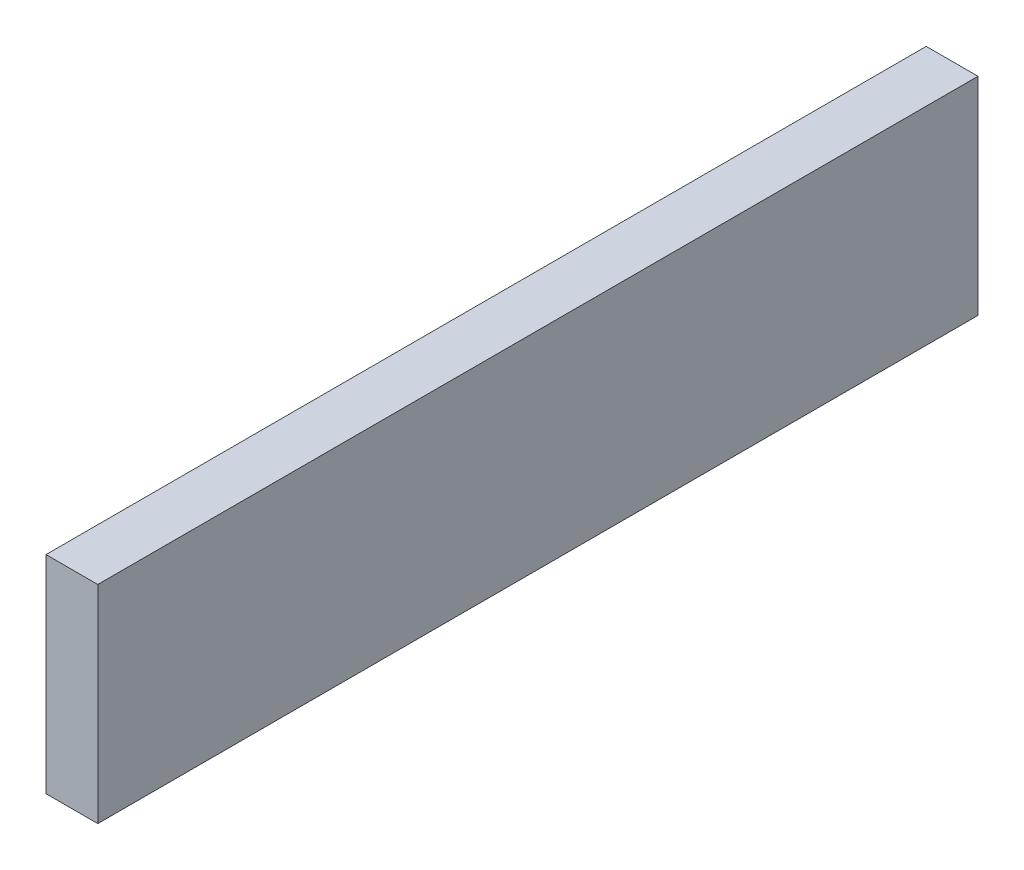
ISO-10303-21;
HEADER;
FILE_DESCRIPTION(('STEP AP214'),'2;1');
FILE_NAME('part.step','',(''),(''),'','','');
FILE_SCHEMA(('AUTOMOTIVE_DESIGN { 1 0 10303 214 1 1 1 1 }'));
ENDSEC;
DATA;
#1=APPLICATION_CONTEXT('core data for automotive mechanical design processes');
#2=APPLICATION_PROTOCOL_DEFINITION('international standard','automotive_design',2000,#1);
#3=PRODUCT_CONTEXT('',#1,'mechanical');
#4=PRODUCT('Part','Part','',(#3));
#5=PRODUCT_RELATED_PRODUCT_CATEGORY('part','',(#4));
#6=PRODUCT_DEFINITION_FORMATION('','',#4);
#7=PRODUCT_DEFINITION_CONTEXT('part definition',#1,'design');
#8=PRODUCT_DEFINITION('design','',#6,#7);
#9=PRODUCT_DEFINITION_SHAPE('','',#8);
#10=(LENGTH_UNIT() NAMED_UNIT(*) SI_UNIT(.MILLI.,.METRE.));
#11=(NAMED_UNIT(*) PLANE_ANGLE_UNIT() SI_UNIT($,.RADIAN.));
#12=(NAMED_UNIT(*) SI_UNIT($,.STERADIAN.) SOLID_ANGLE_UNIT());
#13=UNCERTAINTY_MEASURE_WITH_UNIT(LENGTH_MEASURE(1.E-05),#10,'distance_accuracy_value','');
#14=(GEOMETRIC_REPRESENTATION_CONTEXT(3) GLOBAL_UNCERTAINTY_ASSIGNED_CONTEXT((#13)) GLOBAL_UNIT_ASSIGNED_CONTEXT((#10,
#11,#12)) REPRESENTATION_CONTEXT('',''));
#15=CARTESIAN_POINT('',(0.,0.,0.));
#16=DIRECTION('',(0.,0.,1.));
#17=DIRECTION('',(1.,0.,0.));
#18=AXIS2_PLACEMENT_3D('',#15,#16,#17);
#19=CARTESIAN_POINT('',(-5.,15.,-80.));
#20=DIRECTION('',(1.,0.,0.));
#21=DIRECTION('',(0.,0.,-1.));
#22=AXIS2_PLACEMENT_3D('',#19,#20,#21);
#23=CYLINDRICAL_SURFACE('',#22,2.5);
#24=CARTESIAN_POINT('',(-5.,15.,-80.));
#25=DIRECTION('',(1.,0.,0.));
#26=DIRECTION('',(0.,0.,-1.));
#27=AXIS2_PLACEMENT_3D('',#24,#25,#26);
#28=CIRCLE('',#27,2.5);
#29=CARTESIAN_POINT('',(-5.,15.,-82.5));
#30=VERTEX_POINT('',#29);
#31=EDGE_CURVE('E153',#30,#30,#28,.T.);
#32=ORIENTED_EDGE('',*,*,#31,.F.);
#33=EDGE_LOOP('',(#32));
#34=FACE_BOUND('',#33,.T.);
#35=DIRECTION('',(1.,0.,0.));
#36=VECTOR('',#35,1.);
#37=CARTESIAN_POINT('',(-5.,17.5,-80.));
#38=LINE('',#37,#36);
#39=CARTESIAN_POINT('',(0.,17.5,-80.));
#40=VERTEX_POINT('',#39);
#41=CARTESIAN_POINT('',(-1.14163469475345,17.5,-80.));
#42=VERTEX_POINT('',#41);
#43=EDGE_CURVE('E126',#40,#42,#38,.F.);
#44=ORIENTED_EDGE('',*,*,#43,.F.);
#45=CARTESIAN_POINT('',(0.,15.,-80.));
#46=DIRECTION('',(1.,0.,0.));
#47=DIRECTION('',(0.,0.,-1.));
#48=AXIS2_PLACEMENT_3D('',#45,#46,#47);
#49=CIRCLE('',#48,2.5);
#50=CARTESIAN_POINT('',(0.,12.5,-80.));
#51=VERTEX_POINT('',#50);
#52=EDGE_CURVE('E150',#40,#51,#49,.T.);
#53=ORIENTED_EDGE('',*,*,#52,.T.);
#54=DIRECTION('',(1.,0.,0.));
#55=VECTOR('',#54,1.);
#56=CARTESIAN_POINT('',(-5.,12.5,-80.));
#57=LINE('',#56,#55);
#58=CARTESIAN_POINT('',(-1.14163469475345,12.5,-80.));
#59=VERTEX_POINT('',#58);
#60=EDGE_CURVE('E61',#59,#51,#57,.T.);
#61=ORIENTED_EDGE('',*,*,#60,.F.);
#62=CARTESIAN_POINT('',(-1.14163469475345,12.5,-80.));
#63=CARTESIAN_POINT('',(-1.14160076156349,12.4999926023262,-80.0368502720209));
#64=CARTESIAN_POINT('',(-1.14341979627242,12.5008149573185,-80.073661902073));
#65=CARTESIAN_POINT('',(-1.15046671672525,12.5040470353658,-80.1467838954639));
#66=CARTESIAN_POINT('',(-1.15568474507948,12.5064521684275,-80.1830953992171));
#67=CARTESIAN_POINT('',(-1.17574984538147,12.5158195285853,-80.2895797920049));
#68=CARTESIAN_POINT('',(-1.19503129720871,12.5249399036378,-80.3587436435111));
#69=CARTESIAN_POINT('',(-1.23621034960396,12.5453108304804,-80.4766233272089));
#70=CARTESIAN_POINT('',(-1.25631658794231,12.5554958479592,-80.526205106889));
#71=CARTESIAN_POINT('',(-1.29995963203381,12.5784204069825,-80.6232421432369));
#72=CARTESIAN_POINT('',(-1.32349834580788,12.5911613707986,-80.6706961978512));
#73=CARTESIAN_POINT('',(-1.39814883907714,12.6331964226857,-80.8111031831776));
#74=CARTESIAN_POINT('',(-1.45287485858452,12.6661094830148,-80.9010420636721));
#75=CARTESIAN_POINT('',(-1.55959421692941,12.73623861884,-81.0640857860633));
#76=CARTESIAN_POINT('',(-1.61114375530578,12.772483622706,-81.1379228903791));
#77=CARTESIAN_POINT('',(-1.71533215524021,12.851687642325,-81.2811932461923));
#78=CARTESIAN_POINT('',(-1.76797171065065,12.8946510562687,-81.3506235706434));
#79=CARTESIAN_POINT('',(-1.87260869934322,12.9871583938909,-81.4849551546248));
#80=CARTESIAN_POINT('',(-1.92460775881692,13.0366781555405,-81.5498717694767));
#81=CARTESIAN_POINT('',(-2.0269674090949,13.1425401441895,-81.6752836067289));
#82=CARTESIAN_POINT('',(-2.07732793533397,13.1988826396218,-81.7357786550173));
#83=CARTESIAN_POINT('',(-2.2000763224716,13.3487770259388,-81.8812813344049));
#84=CARTESIAN_POINT('',(-2.27076062917807,13.446761725856,-81.9632601622299));
#85=CARTESIAN_POINT('',(-2.40199184485351,13.6586392494052,-82.1136622825676));
#86=CARTESIAN_POINT('',(-2.46255230632799,13.7725104252558,-82.1821037200708));
#87=CARTESIAN_POINT('',(-2.55860750368915,13.9909809715952,-82.2898933697334));
#88=CARTESIAN_POINT('',(-2.59669230645544,14.0929067887458,-82.3323212540958));
#89=CARTESIAN_POINT('',(-2.66125365331357,14.3048062749799,-82.4039934113646));
#90=CARTESIAN_POINT('',(-2.68773787875698,14.4147745622478,-82.4332464084191));
#91=CARTESIAN_POINT('',(-2.72718514012938,14.6408059676342,-82.4767507613322));
#92=CARTESIAN_POINT('',(-2.74006173855933,14.756903187467,-82.490906220768));
#93=CARTESIAN_POINT('',(-2.75080104032359,14.99061896676,-82.502715205675));
#94=CARTESIAN_POINT('',(-2.74866932696633,15.1082369442241,-82.5003748678203));
#95=CARTESIAN_POINT('',(-2.73060300572644,15.3288318203435,-82.4804992345782));
#96=CARTESIAN_POINT('',(-2.71609949802632,15.4320777366107,-82.4645393037708));
#97=CARTESIAN_POINT('',(-2.67623992461479,15.6337527654284,-82.4205405669562));
#98=CARTESIAN_POINT('',(-2.65088179243374,15.7321809568173,-82.3924994609658));
#99=CARTESIAN_POINT('',(-2.58938300070457,15.92702634459,-82.3241791031935));
#100=CARTESIAN_POINT('',(-2.55277136676985,16.023103713234,-82.2833634880565));
#101=CARTESIAN_POINT('',(-2.47132764746236,16.2066380253475,-82.1919299994505));
#102=CARTESIAN_POINT('',(-2.42649216990778,16.294091388603,-82.141308080579));
#103=CARTESIAN_POINT('',(-2.30516294939391,16.5036366056833,-82.0030202663711));
#104=CARTESIAN_POINT('',(-2.22443057699893,16.6197198394661,-81.9098842225934));
#105=CARTESIAN_POINT('',(-2.09691006790649,16.7779010157724,-81.7590942714993));
#106=CARTESIAN_POINT('',(-2.05323441851514,16.8280592167664,-81.7068619184366));
#107=CARTESIAN_POINT('',(-1.96445229685118,16.9231422669238,-81.5989643676562));
#108=CARTESIAN_POINT('',(-1.91934634802306,16.9680690031459,-81.5433004189109));
#109=CARTESIAN_POINT('',(-1.82736009816155,17.0538101995861,-81.4273040581398));
#110=CARTESIAN_POINT('',(-1.7804634100269,17.0944968018115,-81.366890638058));
#111=CARTESIAN_POINT('',(-1.68694069316833,17.1705269851909,-81.2426250454067));
#112=CARTESIAN_POINT('',(-1.64031457717538,17.2058723931044,-81.1787740587101));
#113=CARTESIAN_POINT('',(-1.54863005708555,17.2711747631872,-81.0474444298911));
#114=CARTESIAN_POINT('',(-1.50356952887258,17.3011392761428,-80.9799710465164));
#115=CARTESIAN_POINT('',(-1.41681154793987,17.3555433946536,-80.8408272694385));
#116=CARTESIAN_POINT('',(-1.37511000697689,17.3799897837555,-80.7691621667494));
#117=CARTESIAN_POINT('',(-1.3018831566406,17.4207442124286,-80.6283407249032));
#118=CARTESIAN_POINT('',(-1.26975386377006,17.4376277796402,-80.5596731596984));
#119=CARTESIAN_POINT('',(-1.2140902850961,17.4658237922952,-80.4181628310735));
#120=CARTESIAN_POINT('',(-1.19050023248075,17.477172559261,-80.3453508885953));
#121=CARTESIAN_POINT('',(-1.16314610329853,17.4900917640084,-80.226703361983));
#122=CARTESIAN_POINT('',(-1.1552185718857,17.4937638802054,-80.1820676712598));
#123=CARTESIAN_POINT('',(-1.14439929747673,17.4987381312888,-80.0916553270764));
#124=CARTESIAN_POINT('',(-1.14155441837776,17.5000182156772,-80.0458719631663));
#125=CARTESIAN_POINT('',(-1.14163469475345,17.5,-80.));
#126=B_SPLINE_CURVE_WITH_KNOTS('',3,(#62,#63,#64,#65,#66,#67,#68,#69,#70,#71,#72,#73,#74,#75,
#76,#77,#78,#79,#80,#81,#82,#83,#84,#85,#86,#87,#88,#89,#90,#91,#92,#93,#94,#95,#96,#97,#98,#99,
#100,#101,#102,#103,#104,#105,#106,#107,#108,#109,#110,#111,#112,#113,#114,#115,#116,#117,#118,
#119,#120,#121,#122,#123,#124,#125),.UNSPECIFIED.,.F.,.F.,(4,2,2,2,2,2,2,2,2,2,2,2,2,2,2,2,2,2,
2,2,2,2,2,2,2,2,2,2,2,2,2,4),(0.,0.110430513479198,0.220542185791148,0.43651832786487,
0.599705091455743,0.762982914441691,1.09296850825457,1.38387832708183,1.67497939279735,
1.96503606986894,2.25510416260649,2.69149720546061,3.12730130018987,3.47626888442438,
3.82500504829078,4.17594335561103,4.52675111571979,4.84175119004055,5.15681125978515,
5.48744292957862,5.81821128670639,6.32314942689101,6.57668526888297,6.83012937195455,
7.08978847282512,7.34935856484583,7.60856151709355,7.86744406892527,8.09994061530373,
8.33089018140405,8.46700588163959,8.60437026462268),.UNSPECIFIED.);
#127=EDGE_CURVE('E218',#59,#42,#126,.T.);
#128=ORIENTED_EDGE('',*,*,#127,.T.);
#129=EDGE_LOOP('',(#44,#53,#61,#128));
#130=FACE_BOUND('',#129,.T.);
#131=ADVANCED_FACE('F33',(#34,#130),#23,.F.);
#132=CARTESIAN_POINT('',(0.,15.,-80.));
#133=DIRECTION('',(1.,0.,0.));
#134=DIRECTION('',(0.,0.,-1.));
#135=AXIS2_PLACEMENT_3D('',#132,#133,#134);
#136=PLANE('',#135);
#137=DIRECTION('',(0.,1.,0.));
#138=VECTOR('',#137,1.);
#139=CARTESIAN_POINT('',(0.,15.,-80.));
#140=LINE('',#139,#138);
#141=EDGE_CURVE('E216',#51,#40,#140,.T.);
#142=ORIENTED_EDGE('',*,*,#141,.F.);
#143=ORIENTED_EDGE('',*,*,#52,.F.);
#144=EDGE_LOOP('',(#142,#143));
#145=FACE_BOUND('',#144,.T.);
#146=ADVANCED_FACE('F267',(#145),#136,.F.);
#147=CARTESIAN_POINT('',(5.,-20.,-85.));
#148=DIRECTION('',(0.,0.,1.));
#149=DIRECTION('',(1.,0.,0.));
#150=AXIS2_PLACEMENT_3D('',#147,#148,#149);
#151=PLANE('',#150);
#152=CARTESIAN_POINT('',(-1.57984021985929E-13,0.,-85.));
#153=DIRECTION('',(0.,0.,-1.));
#154=DIRECTION('',(-1.,0.,0.));
#155=AXIS2_PLACEMENT_3D('',#152,#153,#154);
#156=CIRCLE('',#155,2.74833218084437);
#157=CARTESIAN_POINT('',(-2.74833218084453,0.,-85.));
#158=VERTEX_POINT('',#157);
#159=EDGE_CURVE('E306',#158,#158,#156,.T.);
#160=ORIENTED_EDGE('',*,*,#159,.F.);
#161=EDGE_LOOP('',(#160));
#162=FACE_BOUND('',#161,.T.);
#163=CARTESIAN_POINT('',(0.,-15.,-85.));
#164=DIRECTION('',(0.,0.,-1.));
#165=DIRECTION('',(1.,0.,0.));
#166=AXIS2_PLACEMENT_3D('',#163,#164,#165);
#167=CIRCLE('',#166,2.74833218084437);
#168=CARTESIAN_POINT('',(2.74833218084437,-15.,-85.));
#169=VERTEX_POINT('',#168);
#170=EDGE_CURVE('E110',#169,#169,#167,.T.);
#171=ORIENTED_EDGE('',*,*,#170,.F.);
#172=EDGE_LOOP('',(#171));
#173=FACE_BOUND('',#172,.T.);
#174=CARTESIAN_POINT('',(0.,15.,-85.));
#175=DIRECTION('',(0.,0.,-1.));
#176=DIRECTION('',(-1.,0.,0.));
#177=AXIS2_PLACEMENT_3D('',#174,#175,#176);
#178=CIRCLE('',#177,2.74833218084437);
#179=CARTESIAN_POINT('',(-2.74833218084437,15.,-85.));
#180=VERTEX_POINT('',#179);
#181=EDGE_CURVE('E116',#180,#180,#178,.T.);
#182=ORIENTED_EDGE('',*,*,#181,.F.);
#183=EDGE_LOOP('',(#182));
#184=FACE_BOUND('',#183,.T.);
#185=DIRECTION('',(0.,1.,0.));
#186=VECTOR('',#185,1.);
#187=CARTESIAN_POINT('',(-5.,-20.,-85.));
#188=LINE('',#187,#186);
#189=CARTESIAN_POINT('',(-5.,-20.,-85.));
#190=VERTEX_POINT('',#189);
#191=CARTESIAN_POINT('',(-5.,20.,-85.));
#192=VERTEX_POINT('',#191);
#193=EDGE_CURVE('E184',#190,#192,#188,.T.);
#194=ORIENTED_EDGE('',*,*,#193,.T.);
#195=DIRECTION('',(-1.,0.,0.));
#196=VECTOR('',#195,1.);
#197=CARTESIAN_POINT('',(5.,20.,-85.));
#198=LINE('',#197,#196);
#199=CARTESIAN_POINT('',(5.,20.,-85.));
#200=VERTEX_POINT('',#199);
#201=EDGE_CURVE('E213',#200,#192,#198,.T.);
#202=ORIENTED_EDGE('',*,*,#201,.F.);
#203=DIRECTION('',(0.,1.,0.));
#204=VECTOR('',#203,1.);
#205=CARTESIAN_POINT('',(5.,-20.,-85.));
#206=LINE('',#205,#204);
#207=CARTESIAN_POINT('',(5.,-20.,-85.));
#208=VERTEX_POINT('',#207);
#209=EDGE_CURVE('E187',#208,#200,#206,.T.);
#210=ORIENTED_EDGE('',*,*,#209,.F.);
#211=DIRECTION('',(-1.,0.,0.));
#212=VECTOR('',#211,1.);
#213=CARTESIAN_POINT('',(5.,-20.,-85.));
#214=LINE('',#213,#212);
#215=EDGE_CURVE('E197',#208,#190,#214,.T.);
#216=ORIENTED_EDGE('',*,*,#215,.T.);
#217=EDGE_LOOP('',(#194,#202,#210,#216));
#218=FACE_BOUND('',#217,.T.);
#219=ADVANCED_FACE('F35',(#162,#173,#184,#218),#151,.F.);
#220=CARTESIAN_POINT('',(5.,20.,85.));
#221=DIRECTION('',(0.,-1.,0.));
#222=DIRECTION('',(0.,0.,-1.));
#223=AXIS2_PLACEMENT_3D('',#220,#221,#222);
#224=PLANE('',#223);
#225=DIRECTION('',(0.,0.,1.));
#226=VECTOR('',#225,1.);
#227=CARTESIAN_POINT('',(-5.,20.,85.));
#228=LINE('',#227,#226);
#229=CARTESIAN_POINT('',(-5.,20.,85.));
#230=VERTEX_POINT('',#229);
#231=EDGE_CURVE('E200',#192,#230,#228,.T.);
#232=ORIENTED_EDGE('',*,*,#231,.T.);
#233=DIRECTION('',(-1.,0.,0.));
#234=VECTOR('',#233,1.);
#235=CARTESIAN_POINT('',(5.,20.,85.));
#236=LINE('',#235,#234);
#237=CARTESIAN_POINT('',(5.,20.,85.));
#238=VERTEX_POINT('',#237);
#239=EDGE_CURVE('E210',#238,#230,#236,.T.);
#240=ORIENTED_EDGE('',*,*,#239,.F.);
#241=DIRECTION('',(0.,0.,1.));
#242=VECTOR('',#241,1.);
#243=CARTESIAN_POINT('',(5.,20.,85.));
#244=LINE('',#243,#242);
#245=EDGE_CURVE('E190',#200,#238,#244,.T.);
#246=ORIENTED_EDGE('',*,*,#245,.F.);
#247=ORIENTED_EDGE('',*,*,#201,.T.);
#248=EDGE_LOOP('',(#232,#240,#246,#247));
#249=FACE_BOUND('',#248,.T.);
#250=ADVANCED_FACE('F274',(#249),#224,.F.);
#251=CARTESIAN_POINT('',(5.,-20.,85.));
#252=DIRECTION('',(0.,0.,-1.));
#253=DIRECTION('',(-1.,0.,0.));
#254=AXIS2_PLACEMENT_3D('',#251,#252,#253);
#255=PLANE('',#254);
#256=DIRECTION('',(0.,-1.,0.));
#257=VECTOR('',#256,1.);
#258=CARTESIAN_POINT('',(-5.,-20.,85.));
#259=LINE('',#258,#257);
#260=CARTESIAN_POINT('',(-5.,-20.,85.));
#261=VERTEX_POINT('',#260);
#262=EDGE_CURVE('E202',#230,#261,#259,.T.);
#263=ORIENTED_EDGE('',*,*,#262,.T.);
#264=DIRECTION('',(-1.,0.,0.));
#265=VECTOR('',#264,1.);
#266=CARTESIAN_POINT('',(5.,-20.,85.));
#267=LINE('',#266,#265);
#268=CARTESIAN_POINT('',(5.,-20.,85.));
#269=VERTEX_POINT('',#268);
#270=EDGE_CURVE('E207',#269,#261,#267,.T.);
#271=ORIENTED_EDGE('',*,*,#270,.F.);
#272=DIRECTION('',(0.,-1.,0.));
#273=VECTOR('',#272,1.);
#274=CARTESIAN_POINT('',(5.,-20.,85.));
#275=LINE('',#274,#273);
#276=EDGE_CURVE('E193',#238,#269,#275,.T.);
#277=ORIENTED_EDGE('',*,*,#276,.F.);
#278=ORIENTED_EDGE('',*,*,#239,.T.);
#279=EDGE_LOOP('',(#263,#271,#277,#278));
#280=FACE_BOUND('',#279,.T.);
#281=ADVANCED_FACE('F335',(#280),#255,.F.);
#282=CARTESIAN_POINT('',(5.,-20.,85.));
#283=DIRECTION('',(0.,1.,0.));
#284=DIRECTION('',(0.,0.,1.));
#285=AXIS2_PLACEMENT_3D('',#282,#283,#284);
#286=PLANE('',#285);
#287=DIRECTION('',(0.,0.,-1.));
#288=VECTOR('',#287,1.);
#289=CARTESIAN_POINT('',(-5.,-20.,85.));
#290=LINE('',#289,#288);
#291=EDGE_CURVE('E191',#261,#190,#290,.T.);
#292=ORIENTED_EDGE('',*,*,#291,.T.);
#293=ORIENTED_EDGE('',*,*,#215,.F.);
#294=DIRECTION('',(0.,0.,-1.));
#295=VECTOR('',#294,1.);
#296=CARTESIAN_POINT('',(5.,-20.,85.));
#297=LINE('',#296,#295);
#298=EDGE_CURVE('E195',#269,#208,#297,.T.);
#299=ORIENTED_EDGE('',*,*,#298,.F.);
#300=ORIENTED_EDGE('',*,*,#270,.T.);
#301=EDGE_LOOP('',(#292,#293,#299,#300));
#302=FACE_BOUND('',#301,.T.);
#303=ADVANCED_FACE('F333',(#302),#286,.F.);
#304=CARTESIAN_POINT('',(5.,0.,0.));
#305=DIRECTION('',(-1.,0.,0.));
#306=DIRECTION('',(0.,0.,1.));
#307=AXIS2_PLACEMENT_3D('',#304,#305,#306);
#308=PLANE('',#307);
#309=ORIENTED_EDGE('',*,*,#209,.T.);
#310=ORIENTED_EDGE('',*,*,#245,.T.);
#311=ORIENTED_EDGE('',*,*,#276,.T.);
#312=ORIENTED_EDGE('',*,*,#298,.T.);
#313=EDGE_LOOP('',(#309,#310,#311,#312));
#314=FACE_BOUND('',#313,.T.);
#315=ADVANCED_FACE('F329',(#314),#308,.F.);
#316=CARTESIAN_POINT('',(-5.,0.,0.));
#317=DIRECTION('',(-1.,0.,0.));
#318=DIRECTION('',(0.,0.,1.));
#319=AXIS2_PLACEMENT_3D('',#316,#317,#318);
#320=PLANE('',#319);
#321=CARTESIAN_POINT('',(-5.,-15.,80.));
#322=DIRECTION('',(1.,0.,0.));
#323=DIRECTION('',(0.,0.,1.));
#324=AXIS2_PLACEMENT_3D('',#321,#322,#323);
#325=CIRCLE('',#324,2.5);
#326=CARTESIAN_POINT('',(-5.,-15.,82.5));
#327=VERTEX_POINT('',#326);
#328=EDGE_CURVE('E129',#327,#327,#325,.T.);
#329=ORIENTED_EDGE('',*,*,#328,.T.);
#330=EDGE_LOOP('',(#329));
#331=FACE_BOUND('',#330,.T.);
#332=CARTESIAN_POINT('',(-5.,-15.,40.));
#333=DIRECTION('',(1.,0.,0.));
#334=DIRECTION('',(0.,0.,1.));
#335=AXIS2_PLACEMENT_3D('',#332,#333,#334);
#336=CIRCLE('',#335,2.5);
#337=CARTESIAN_POINT('',(-5.,-15.,42.5));
#338=VERTEX_POINT('',#337);
#339=EDGE_CURVE('E135',#338,#338,#336,.T.);
#340=ORIENTED_EDGE('',*,*,#339,.T.);
#341=EDGE_LOOP('',(#340));
#342=FACE_BOUND('',#341,.T.);
#343=CARTESIAN_POINT('',(-5.,-15.,0.));
#344=DIRECTION('',(1.,0.,0.));
#345=DIRECTION('',(0.,0.,1.));
#346=AXIS2_PLACEMENT_3D('',#343,#344,#345);
#347=CIRCLE('',#346,2.5);
#348=CARTESIAN_POINT('',(-5.,-15.,2.50000000000001));
#349=VERTEX_POINT('',#348);
#350=EDGE_CURVE('E141',#349,#349,#347,.T.);
#351=ORIENTED_EDGE('',*,*,#350,.T.);
#352=EDGE_LOOP('',(#351));
#353=FACE_BOUND('',#352,.T.);
#354=CARTESIAN_POINT('',(-5.,-15.,-40.));
#355=DIRECTION('',(1.,0.,0.));
#356=DIRECTION('',(0.,0.,1.));
#357=AXIS2_PLACEMENT_3D('',#354,#355,#356);
#358=CIRCLE('',#357,2.5);
#359=CARTESIAN_POINT('',(-5.,-15.,-37.5));
#360=VERTEX_POINT('',#359);
#361=EDGE_CURVE('E147',#360,#360,#358,.T.);
#362=ORIENTED_EDGE('',*,*,#361,.T.);
#363=EDGE_LOOP('',(#362));
#364=FACE_BOUND('',#363,.T.);
#365=ORIENTED_EDGE('',*,*,#31,.T.);
#366=EDGE_LOOP('',(#365));
#367=FACE_BOUND('',#366,.T.);
#368=CARTESIAN_POINT('',(-5.,15.,-40.));
#369=DIRECTION('',(1.,0.,0.));
#370=DIRECTION('',(0.,0.,-1.));
#371=AXIS2_PLACEMENT_3D('',#368,#369,#370);
#372=CIRCLE('',#371,2.5);
#373=CARTESIAN_POINT('',(-5.,15.,-42.5));
#374=VERTEX_POINT('',#373);
#375=EDGE_CURVE('E159',#374,#374,#372,.T.);
#376=ORIENTED_EDGE('',*,*,#375,.T.);
#377=EDGE_LOOP('',(#376));
#378=FACE_BOUND('',#377,.T.);
#379=CARTESIAN_POINT('',(-5.,15.,0.));
#380=DIRECTION('',(1.,0.,0.));
#381=DIRECTION('',(0.,0.,-1.));
#382=AXIS2_PLACEMENT_3D('',#379,#380,#381);
#383=CIRCLE('',#382,2.5);
#384=CARTESIAN_POINT('',(-5.,15.,-2.49999999999998));
#385=VERTEX_POINT('',#384);
#386=EDGE_CURVE('E165',#385,#385,#383,.T.);
#387=ORIENTED_EDGE('',*,*,#386,.T.);
#388=EDGE_LOOP('',(#387));
#389=FACE_BOUND('',#388,.T.);
#390=CARTESIAN_POINT('',(-5.,15.,40.));
#391=DIRECTION('',(1.,0.,0.));
#392=DIRECTION('',(0.,0.,-1.));
#393=AXIS2_PLACEMENT_3D('',#390,#391,#392);
#394=CIRCLE('',#393,2.5);
#395=CARTESIAN_POINT('',(-5.,15.,37.5));
#396=VERTEX_POINT('',#395);
#397=EDGE_CURVE('E171',#396,#396,#394,.T.);
#398=ORIENTED_EDGE('',*,*,#397,.T.);
#399=EDGE_LOOP('',(#398));
#400=FACE_BOUND('',#399,.T.);
#401=CARTESIAN_POINT('',(-5.,-15.,-80.));
#402=DIRECTION('',(1.,0.,0.));
#403=DIRECTION('',(0.,0.,1.));
#404=AXIS2_PLACEMENT_3D('',#401,#402,#403);
#405=CIRCLE('',#404,2.5);
#406=CARTESIAN_POINT('',(-5.,-15.,-77.5));
#407=VERTEX_POINT('',#406);
#408=EDGE_CURVE('E176',#407,#407,#405,.T.);
#409=ORIENTED_EDGE('',*,*,#408,.T.);
#410=EDGE_LOOP('',(#409));
#411=FACE_BOUND('',#410,.T.);
#412=CARTESIAN_POINT('',(-5.,15.,80.));
#413=DIRECTION('',(1.,0.,0.));
#414=DIRECTION('',(0.,0.,-1.));
#415=AXIS2_PLACEMENT_3D('',#412,#413,#414);
#416=CIRCLE('',#415,2.5);
#417=CARTESIAN_POINT('',(-5.,15.,77.5));
#418=VERTEX_POINT('',#417);
#419=EDGE_CURVE('E181',#418,#418,#416,.T.);
#420=ORIENTED_EDGE('',*,*,#419,.T.);
#421=EDGE_LOOP('',(#420));
#422=FACE_BOUND('',#421,.T.);
#423=ORIENTED_EDGE('',*,*,#193,.F.);
#424=ORIENTED_EDGE('',*,*,#291,.F.);
#425=ORIENTED_EDGE('',*,*,#262,.F.);
#426=ORIENTED_EDGE('',*,*,#231,.F.);
#427=EDGE_LOOP('',(#423,#424,#425,#426));
#428=FACE_BOUND('',#427,.T.);
#429=ADVANCED_FACE('F323',(#331,#342,#353,#364,#367,#378,#389,#400,#411,#422,#428),#320,.T.);
#430=CARTESIAN_POINT('',(-5.,15.,80.));
#431=DIRECTION('',(1.,0.,0.));
#432=DIRECTION('',(0.,0.,-1.));
#433=AXIS2_PLACEMENT_3D('',#430,#431,#432);
#434=CYLINDRICAL_SURFACE('',#433,2.5);
#435=ORIENTED_EDGE('',*,*,#419,.F.);
#436=EDGE_LOOP('',(#435));
#437=FACE_BOUND('',#436,.T.);
#438=CARTESIAN_POINT('',(0.,15.,80.));
#439=DIRECTION('',(1.,0.,0.));
#440=DIRECTION('',(0.,0.,-1.));
#441=AXIS2_PLACEMENT_3D('',#438,#439,#440);
#442=CIRCLE('',#441,2.5);
#443=CARTESIAN_POINT('',(0.,15.,77.5));
#444=VERTEX_POINT('',#443);
#445=EDGE_CURVE('E179',#444,#444,#442,.T.);
#446=ORIENTED_EDGE('',*,*,#445,.T.);
#447=EDGE_LOOP('',(#446));
#448=FACE_BOUND('',#447,.T.);
#449=ADVANCED_FACE('F346',(#437,#448),#434,.F.);
#450=CARTESIAN_POINT('',(0.,15.,80.));
#451=DIRECTION('',(1.,0.,0.));
#452=DIRECTION('',(0.,0.,-1.));
#453=AXIS2_PLACEMENT_3D('',#450,#451,#452);
#454=PLANE('',#453);
#455=ORIENTED_EDGE('',*,*,#445,.F.);
#456=EDGE_LOOP('',(#455));
#457=FACE_BOUND('',#456,.T.);
#458=ADVANCED_FACE('F352',(#457),#454,.F.);
#459=CARTESIAN_POINT('',(-5.,-15.,-80.));
#460=DIRECTION('',(1.,0.,0.));
#461=DIRECTION('',(0.,0.,-1.));
#462=AXIS2_PLACEMENT_3D('',#459,#460,#461);
#463=CYLINDRICAL_SURFACE('',#462,2.5);
#464=ORIENTED_EDGE('',*,*,#408,.F.);
#465=EDGE_LOOP('',(#464));
#466=FACE_BOUND('',#465,.T.);
#467=CARTESIAN_POINT('',(0.,-15.,-80.));
#468=DIRECTION('',(1.,0.,0.));
#469=DIRECTION('',(0.,0.,1.));
#470=AXIS2_PLACEMENT_3D('',#467,#468,#469);
#471=CIRCLE('',#470,2.5);
#472=CARTESIAN_POINT('',(0.,-12.5,-80.));
#473=VERTEX_POINT('',#472);
#474=CARTESIAN_POINT('',(0.,-17.5,-80.));
#475=VERTEX_POINT('',#474);
#476=EDGE_CURVE('E115',#473,#475,#471,.T.);
#477=ORIENTED_EDGE('',*,*,#476,.T.);
#478=DIRECTION('',(1.,0.,0.));
#479=VECTOR('',#478,1.);
#480=CARTESIAN_POINT('',(-5.,-17.5,-80.));
#481=LINE('',#480,#479);
#482=CARTESIAN_POINT('',(-1.14163469475345,-17.5,-80.));
#483=VERTEX_POINT('',#482);
#484=EDGE_CURVE('E53',#475,#483,#481,.F.);
#485=ORIENTED_EDGE('',*,*,#484,.T.);
#486=CARTESIAN_POINT('',(-1.14163469475345,-17.5,-80.));
#487=CARTESIAN_POINT('',(-1.14160076156349,-17.5000073976738,-80.0368502720209));
#488=CARTESIAN_POINT('',(-1.14341979627242,-17.4991850426815,-80.073661902073));
#489=CARTESIAN_POINT('',(-1.15046671672525,-17.4959529646342,-80.1467838954639));
#490=CARTESIAN_POINT('',(-1.15568474507948,-17.4935478315725,-80.1830953992171));
#491=CARTESIAN_POINT('',(-1.17574984538148,-17.4841804714147,-80.2895797920049));
#492=CARTESIAN_POINT('',(-1.19503129720871,-17.4750600963622,-80.3587436435111));
#493=CARTESIAN_POINT('',(-1.23621034960396,-17.4546891695196,-80.4766233272089));
#494=CARTESIAN_POINT('',(-1.25631658794231,-17.4445041520408,-80.526205106889));
#495=CARTESIAN_POINT('',(-1.29995963203381,-17.4215795930175,-80.6232421432369));
#496=CARTESIAN_POINT('',(-1.32349834580788,-17.4088386292014,-80.6706961978512));
#497=CARTESIAN_POINT('',(-1.39814883907714,-17.3668035773143,-80.8111031831776));
#498=CARTESIAN_POINT('',(-1.45287485858452,-17.3338905169852,-80.9010420636721));
#499=CARTESIAN_POINT('',(-1.55959421692941,-17.26376138116,-81.0640857860633));
#500=CARTESIAN_POINT('',(-1.61114375530578,-17.227516377294,-81.1379228903791));
#501=CARTESIAN_POINT('',(-1.71533215524021,-17.148312357675,-81.2811932461923));
#502=CARTESIAN_POINT('',(-1.76797171065065,-17.1053489437313,-81.3506235706434));
#503=CARTESIAN_POINT('',(-1.87260869934322,-17.0128416061091,-81.4849551546248));
#504=CARTESIAN_POINT('',(-1.92460775881692,-16.9633218444595,-81.5498717694767));
#505=CARTESIAN_POINT('',(-2.0269674090949,-16.8574598558105,-81.6752836067289));
#506=CARTESIAN_POINT('',(-2.07732793533397,-16.8011173603782,-81.7357786550173));
#507=CARTESIAN_POINT('',(-2.2000763224716,-16.6512229740612,-81.8812813344049));
#508=CARTESIAN_POINT('',(-2.27076062917807,-16.553238274144,-81.9632601622299));
#509=CARTESIAN_POINT('',(-2.4019918448535,-16.3413607505948,-82.1136622825676));
#510=CARTESIAN_POINT('',(-2.46255230632798,-16.2274895747442,-82.1821037200708));
#511=CARTESIAN_POINT('',(-2.55860750368915,-16.0090190284048,-82.2898933697334));
#512=CARTESIAN_POINT('',(-2.59669230645543,-15.9070932112542,-82.3323212540958));
#513=CARTESIAN_POINT('',(-2.66125365331357,-15.6951937250201,-82.4039934113646));
#514=CARTESIAN_POINT('',(-2.68773787875697,-15.5852254377523,-82.4332464084191));
#515=CARTESIAN_POINT('',(-2.72718514012938,-15.3591940323658,-82.4767507613322));
#516=CARTESIAN_POINT('',(-2.74006173855933,-15.243096812533,-82.490906220768));
#517=CARTESIAN_POINT('',(-2.75080104032359,-15.00938103324,-82.502715205675));
#518=CARTESIAN_POINT('',(-2.74866932696633,-14.8917630557759,-82.5003748678203));
#519=CARTESIAN_POINT('',(-2.73060300572644,-14.6711681796565,-82.4804992345782));
#520=CARTESIAN_POINT('',(-2.71609949802633,-14.5679222633893,-82.4645393037708));
#521=CARTESIAN_POINT('',(-2.6762399246148,-14.3662472345716,-82.4205405669562));
#522=CARTESIAN_POINT('',(-2.65088179243375,-14.2678190431827,-82.3924994609658));
#523=CARTESIAN_POINT('',(-2.58938300070457,-14.07297365541,-82.3241791031935));
#524=CARTESIAN_POINT('',(-2.55277136676986,-13.976896286766,-82.2833634880565));
#525=CARTESIAN_POINT('',(-2.47132764746236,-13.7933619746525,-82.1919299994505));
#526=CARTESIAN_POINT('',(-2.42649216990778,-13.7059086113971,-82.141308080579));
#527=CARTESIAN_POINT('',(-2.30516294939392,-13.4963633943167,-82.0030202663711));
#528=CARTESIAN_POINT('',(-2.22443057699893,-13.3802801605339,-81.9098842225934));
#529=CARTESIAN_POINT('',(-2.09691006790649,-13.2220989842276,-81.7590942714993));
#530=CARTESIAN_POINT('',(-2.05323441851515,-13.1719407832336,-81.7068619184367));
#531=CARTESIAN_POINT('',(-1.96445229685118,-13.0768577330762,-81.5989643676562));
#532=CARTESIAN_POINT('',(-1.91934634802306,-13.0319309968541,-81.5433004189109));
#533=CARTESIAN_POINT('',(-1.82736009816155,-12.9461898004139,-81.4273040581399));
#534=CARTESIAN_POINT('',(-1.78046341002691,-12.9055031981885,-81.3668906380581));
#535=CARTESIAN_POINT('',(-1.68694069316834,-12.8294730148091,-81.2426250454067));
#536=CARTESIAN_POINT('',(-1.64031457717539,-12.7941276068956,-81.1787740587101));
#537=CARTESIAN_POINT('',(-1.54863005708556,-12.7288252368128,-81.0474444298911));
#538=CARTESIAN_POINT('',(-1.50356952887259,-12.6988607238572,-80.9799710465164));
#539=CARTESIAN_POINT('',(-1.41681154793988,-12.6444566053464,-80.8408272694385));
#540=CARTESIAN_POINT('',(-1.37511000697689,-12.6200102162445,-80.7691621667494));
#541=CARTESIAN_POINT('',(-1.3018831566406,-12.5792557875714,-80.6283407249032));
#542=CARTESIAN_POINT('',(-1.26975386377006,-12.5623722203598,-80.5596731596985));
#543=CARTESIAN_POINT('',(-1.21409028509611,-12.5341762077048,-80.4181628310735));
#544=CARTESIAN_POINT('',(-1.19050023248075,-12.522827440739,-80.3453508885953));
#545=CARTESIAN_POINT('',(-1.16314610329853,-12.5099082359916,-80.226703361983));
#546=CARTESIAN_POINT('',(-1.1552185718857,-12.5062361197946,-80.1820676712598));
#547=CARTESIAN_POINT('',(-1.14439929747673,-12.5012618687112,-80.0916553270764));
#548=CARTESIAN_POINT('',(-1.14155441837776,-12.4999817843228,-80.0458719631663));
#549=CARTESIAN_POINT('',(-1.14163469475345,-12.5,-80.));
#550=B_SPLINE_CURVE_WITH_KNOTS('',3,(#486,#487,#488,#489,#490,#491,#492,#493,#494,#495,#496,
#497,#498,#499,#500,#501,#502,#503,#504,#505,#506,#507,#508,#509,#510,#511,#512,#513,#514,#515,
#516,#517,#518,#519,#520,#521,#522,#523,#524,#525,#526,#527,#528,#529,#530,#531,#532,#533,#534,
#535,#536,#537,#538,#539,#540,#541,#542,#543,#544,#545,#546,#547,#548,#549),.UNSPECIFIED.,.F.,
.F.,(4,2,2,2,2,2,2,2,2,2,2,2,2,2,2,2,2,2,2,2,2,2,2,2,2,2,2,2,2,2,2,4),(0.,0.110430513479198,
0.220542185791162,0.43651832786487,0.599705091455743,0.762982914441691,1.09296850825457,
1.38387832708183,1.67497939279735,1.96503606986894,2.25510416260649,2.6914972054606,
3.12730130018985,3.47626888442436,3.82500504829076,4.17594335561101,4.52675111571978,
4.84175119004054,5.15681125978514,5.48744292957861,5.81821128670638,6.323149426891,
6.57668526888295,6.83012937195454,7.0897884728251,7.34935856484581,7.60856151709353,
7.86744406892527,8.09994061530371,8.33089018140403,8.46700588163958,8.60437026462268),.UNSPECIFIED.);
#551=CARTESIAN_POINT('',(-1.14163469475345,-12.5,-80.));
#552=VERTEX_POINT('',#551);
#553=EDGE_CURVE('E11',#483,#552,#550,.T.);
#554=ORIENTED_EDGE('',*,*,#553,.T.);
#555=DIRECTION('',(1.,0.,0.));
#556=VECTOR('',#555,1.);
#557=CARTESIAN_POINT('',(-5.,-12.5,-80.));
#558=LINE('',#557,#556);
#559=EDGE_CURVE('E109',#552,#473,#558,.T.);
#560=ORIENTED_EDGE('',*,*,#559,.T.);
#561=EDGE_LOOP('',(#477,#485,#554,#560));
#562=FACE_BOUND('',#561,.T.);
#563=ADVANCED_FACE('F113',(#466,#562),#463,.F.);
#564=CARTESIAN_POINT('',(0.,-15.,-80.));
#565=DIRECTION('',(-1.,0.,0.));
#566=DIRECTION('',(0.,0.,1.));
#567=AXIS2_PLACEMENT_3D('',#564,#565,#566);
#568=PLANE('',#567);
#569=DIRECTION('',(0.,1.,0.));
#570=VECTOR('',#569,1.);
#571=CARTESIAN_POINT('',(0.,-15.,-80.));
#572=LINE('',#571,#570);
#573=EDGE_CURVE('E46',#475,#473,#572,.T.);
#574=ORIENTED_EDGE('',*,*,#573,.F.);
#575=ORIENTED_EDGE('',*,*,#476,.F.);
#576=EDGE_LOOP('',(#574,#575));
#577=FACE_BOUND('',#576,.T.);
#578=ADVANCED_FACE('F359',(#577),#568,.T.);
#579=CARTESIAN_POINT('',(-5.,15.,40.));
#580=DIRECTION('',(1.,0.,0.));
#581=DIRECTION('',(0.,0.,-1.));
#582=AXIS2_PLACEMENT_3D('',#579,#580,#581);
#583=CYLINDRICAL_SURFACE('',#582,2.5);
#584=ORIENTED_EDGE('',*,*,#397,.F.);
#585=EDGE_LOOP('',(#584));
#586=FACE_BOUND('',#585,.T.);
#587=CARTESIAN_POINT('',(0.,15.,40.));
#588=DIRECTION('',(1.,0.,0.));
#589=DIRECTION('',(0.,0.,-1.));
#590=AXIS2_PLACEMENT_3D('',#587,#588,#589);
#591=CIRCLE('',#590,2.5);
#592=CARTESIAN_POINT('',(0.,15.,37.5));
#593=VERTEX_POINT('',#592);
#594=EDGE_CURVE('E168',#593,#593,#591,.T.);
#595=ORIENTED_EDGE('',*,*,#594,.T.);
#596=EDGE_LOOP('',(#595));
#597=FACE_BOUND('',#596,.T.);
#598=ADVANCED_FACE('F363',(#586,#597),#583,.F.);
#599=CARTESIAN_POINT('',(0.,15.,40.));
#600=DIRECTION('',(1.,0.,0.));
#601=DIRECTION('',(0.,0.,-1.));
#602=AXIS2_PLACEMENT_3D('',#599,#600,#601);
#603=PLANE('',#602);
#604=ORIENTED_EDGE('',*,*,#594,.F.);
#605=EDGE_LOOP('',(#604));
#606=FACE_BOUND('',#605,.T.);
#607=ADVANCED_FACE('F367',(#606),#603,.F.);
#608=CARTESIAN_POINT('',(-5.,15.,0.));
#609=DIRECTION('',(1.,0.,0.));
#610=DIRECTION('',(0.,0.,-1.));
#611=AXIS2_PLACEMENT_3D('',#608,#609,#610);
#612=CYLINDRICAL_SURFACE('',#611,2.5);
#613=ORIENTED_EDGE('',*,*,#386,.F.);
#614=EDGE_LOOP('',(#613));
#615=FACE_BOUND('',#614,.T.);
#616=CARTESIAN_POINT('',(0.,15.,0.));
#617=DIRECTION('',(1.,0.,0.));
#618=DIRECTION('',(0.,0.,-1.));
#619=AXIS2_PLACEMENT_3D('',#616,#617,#618);
#620=CIRCLE('',#619,2.5);
#621=CARTESIAN_POINT('',(0.,15.,-2.49999999999998));
#622=VERTEX_POINT('',#621);
#623=EDGE_CURVE('E162',#622,#622,#620,.T.);
#624=ORIENTED_EDGE('',*,*,#623,.T.);
#625=EDGE_LOOP('',(#624));
#626=FACE_BOUND('',#625,.T.);
#627=ADVANCED_FACE('F371',(#615,#626),#612,.F.);
#628=CARTESIAN_POINT('',(0.,15.,0.));
#629=DIRECTION('',(1.,0.,0.));
#630=DIRECTION('',(0.,0.,-1.));
#631=AXIS2_PLACEMENT_3D('',#628,#629,#630);
#632=PLANE('',#631);
#633=ORIENTED_EDGE('',*,*,#623,.F.);
#634=EDGE_LOOP('',(#633));
#635=FACE_BOUND('',#634,.T.);
#636=ADVANCED_FACE('F375',(#635),#632,.F.);
#637=CARTESIAN_POINT('',(-5.,15.,-40.));
#638=DIRECTION('',(1.,0.,0.));
#639=DIRECTION('',(0.,0.,-1.));
#640=AXIS2_PLACEMENT_3D('',#637,#638,#639);
#641=CYLINDRICAL_SURFACE('',#640,2.5);
#642=ORIENTED_EDGE('',*,*,#375,.F.);
#643=EDGE_LOOP('',(#642));
#644=FACE_BOUND('',#643,.T.);
#645=CARTESIAN_POINT('',(0.,15.,-40.));
#646=DIRECTION('',(1.,0.,0.));
#647=DIRECTION('',(0.,0.,-1.));
#648=AXIS2_PLACEMENT_3D('',#645,#646,#647);
#649=CIRCLE('',#648,2.5);
#650=CARTESIAN_POINT('',(0.,15.,-42.5));
#651=VERTEX_POINT('',#650);
#652=EDGE_CURVE('E156',#651,#651,#649,.T.);
#653=ORIENTED_EDGE('',*,*,#652,.T.);
#654=EDGE_LOOP('',(#653));
#655=FACE_BOUND('',#654,.T.);
#656=ADVANCED_FACE('F379',(#644,#655),#641,.F.);
#657=CARTESIAN_POINT('',(0.,15.,-40.));
#658=DIRECTION('',(1.,0.,0.));
#659=DIRECTION('',(0.,0.,-1.));
#660=AXIS2_PLACEMENT_3D('',#657,#658,#659);
#661=PLANE('',#660);
#662=ORIENTED_EDGE('',*,*,#652,.F.);
#663=EDGE_LOOP('',(#662));
#664=FACE_BOUND('',#663,.T.);
#665=ADVANCED_FACE('F265',(#664),#661,.F.);
#666=CARTESIAN_POINT('',(-5.,-15.,-40.));
#667=DIRECTION('',(1.,0.,0.));
#668=DIRECTION('',(0.,0.,-1.));
#669=AXIS2_PLACEMENT_3D('',#666,#667,#668);
#670=CYLINDRICAL_SURFACE('',#669,2.5);
#671=ORIENTED_EDGE('',*,*,#361,.F.);
#672=EDGE_LOOP('',(#671));
#673=FACE_BOUND('',#672,.T.);
#674=CARTESIAN_POINT('',(0.,-15.,-40.));
#675=DIRECTION('',(1.,0.,0.));
#676=DIRECTION('',(0.,0.,1.));
#677=AXIS2_PLACEMENT_3D('',#674,#675,#676);
#678=CIRCLE('',#677,2.5);
#679=CARTESIAN_POINT('',(0.,-15.,-37.5));
#680=VERTEX_POINT('',#679);
#681=EDGE_CURVE('E144',#680,#680,#678,.T.);
#682=ORIENTED_EDGE('',*,*,#681,.T.);
#683=EDGE_LOOP('',(#682));
#684=FACE_BOUND('',#683,.T.);
#685=ADVANCED_FACE('F262',(#673,#684),#670,.F.);
#686=CARTESIAN_POINT('',(0.,-15.,-40.));
#687=DIRECTION('',(-1.,0.,0.));
#688=DIRECTION('',(0.,0.,1.));
#689=AXIS2_PLACEMENT_3D('',#686,#687,#688);
#690=PLANE('',#689);
#691=ORIENTED_EDGE('',*,*,#681,.F.);
#692=EDGE_LOOP('',(#691));
#693=FACE_BOUND('',#692,.T.);
#694=ADVANCED_FACE('F258',(#693),#690,.T.);
#695=CARTESIAN_POINT('',(-5.,-15.,0.));
#696=DIRECTION('',(1.,0.,0.));
#697=DIRECTION('',(0.,0.,-1.));
#698=AXIS2_PLACEMENT_3D('',#695,#696,#697);
#699=CYLINDRICAL_SURFACE('',#698,2.5);
#700=ORIENTED_EDGE('',*,*,#350,.F.);
#701=EDGE_LOOP('',(#700));
#702=FACE_BOUND('',#701,.T.);
#703=CARTESIAN_POINT('',(0.,-15.,0.));
#704=DIRECTION('',(1.,0.,0.));
#705=DIRECTION('',(0.,0.,1.));
#706=AXIS2_PLACEMENT_3D('',#703,#704,#705);
#707=CIRCLE('',#706,2.5);
#708=CARTESIAN_POINT('',(0.,-15.,2.50000000000001));
#709=VERTEX_POINT('',#708);
#710=EDGE_CURVE('E138',#709,#709,#707,.T.);
#711=ORIENTED_EDGE('',*,*,#710,.T.);
#712=EDGE_LOOP('',(#711));
#713=FACE_BOUND('',#712,.T.);
#714=ADVANCED_FACE('F254',(#702,#713),#699,.F.);
#715=CARTESIAN_POINT('',(0.,-15.,0.));
#716=DIRECTION('',(-1.,0.,0.));
#717=DIRECTION('',(0.,0.,1.));
#718=AXIS2_PLACEMENT_3D('',#715,#716,#717);
#719=PLANE('',#718);
#720=ORIENTED_EDGE('',*,*,#710,.F.);
#721=EDGE_LOOP('',(#720));
#722=FACE_BOUND('',#721,.T.);
#723=ADVANCED_FACE('F250',(#722),#719,.T.);
#724=CARTESIAN_POINT('',(-5.,-15.,40.));
#725=DIRECTION('',(1.,0.,0.));
#726=DIRECTION('',(0.,0.,-1.));
#727=AXIS2_PLACEMENT_3D('',#724,#725,#726);
#728=CYLINDRICAL_SURFACE('',#727,2.5);
#729=ORIENTED_EDGE('',*,*,#339,.F.);
#730=EDGE_LOOP('',(#729));
#731=FACE_BOUND('',#730,.T.);
#732=CARTESIAN_POINT('',(0.,-15.,40.));
#733=DIRECTION('',(1.,0.,0.));
#734=DIRECTION('',(0.,0.,1.));
#735=AXIS2_PLACEMENT_3D('',#732,#733,#734);
#736=CIRCLE('',#735,2.5);
#737=CARTESIAN_POINT('',(0.,-15.,42.5));
#738=VERTEX_POINT('',#737);
#739=EDGE_CURVE('E132',#738,#738,#736,.T.);
#740=ORIENTED_EDGE('',*,*,#739,.T.);
#741=EDGE_LOOP('',(#740));
#742=FACE_BOUND('',#741,.T.);
#743=ADVANCED_FACE('F246',(#731,#742),#728,.F.);
#744=CARTESIAN_POINT('',(0.,-15.,40.));
#745=DIRECTION('',(-1.,0.,0.));
#746=DIRECTION('',(0.,0.,1.));
#747=AXIS2_PLACEMENT_3D('',#744,#745,#746);
#748=PLANE('',#747);
#749=ORIENTED_EDGE('',*,*,#739,.F.);
#750=EDGE_LOOP('',(#749));
#751=FACE_BOUND('',#750,.T.);
#752=ADVANCED_FACE('F242',(#751),#748,.T.);
#753=CARTESIAN_POINT('',(-5.,-15.,80.));
#754=DIRECTION('',(1.,0.,0.));
#755=DIRECTION('',(0.,0.,-1.));
#756=AXIS2_PLACEMENT_3D('',#753,#754,#755);
#757=CYLINDRICAL_SURFACE('',#756,2.5);
#758=ORIENTED_EDGE('',*,*,#328,.F.);
#759=EDGE_LOOP('',(#758));
#760=FACE_BOUND('',#759,.T.);
#761=CARTESIAN_POINT('',(0.,-15.,80.));
#762=DIRECTION('',(1.,0.,0.));
#763=DIRECTION('',(0.,0.,1.));
#764=AXIS2_PLACEMENT_3D('',#761,#762,#763);
#765=CIRCLE('',#764,2.5);
#766=CARTESIAN_POINT('',(0.,-15.,82.5));
#767=VERTEX_POINT('',#766);
#768=EDGE_CURVE('E128',#767,#767,#765,.T.);
#769=ORIENTED_EDGE('',*,*,#768,.T.);
#770=EDGE_LOOP('',(#769));
#771=FACE_BOUND('',#770,.T.);
#772=ADVANCED_FACE('F238',(#760,#771),#757,.F.);
#773=CARTESIAN_POINT('',(0.,-15.,80.));
#774=DIRECTION('',(-1.,0.,0.));
#775=DIRECTION('',(0.,0.,1.));
#776=AXIS2_PLACEMENT_3D('',#773,#774,#775);
#777=PLANE('',#776);
#778=ORIENTED_EDGE('',*,*,#768,.F.);
#779=EDGE_LOOP('',(#778));
#780=FACE_BOUND('',#779,.T.);
#781=ADVANCED_FACE('F234',(#780),#777,.T.);
#782=CARTESIAN_POINT('',(0.,15.,-80.));
#783=DIRECTION('',(0.,0.,-1.));
#784=DIRECTION('',(-1.,0.,0.));
#785=AXIS2_PLACEMENT_3D('',#782,#783,#784);
#786=CYLINDRICAL_SURFACE('',#785,2.74833218084437);
#787=ORIENTED_EDGE('',*,*,#181,.T.);
#788=EDGE_LOOP('',(#787));
#789=FACE_BOUND('',#788,.T.);
#790=CARTESIAN_POINT('',(0.,15.,-80.));
#791=DIRECTION('',(0.,0.,-1.));
#792=DIRECTION('',(-1.,0.,0.));
#793=AXIS2_PLACEMENT_3D('',#790,#791,#792);
#794=CIRCLE('',#793,2.74833218084437);
#795=EDGE_CURVE('E119',#42,#59,#794,.T.);
#796=ORIENTED_EDGE('',*,*,#795,.F.);
#797=ORIENTED_EDGE('',*,*,#127,.F.);
#798=EDGE_LOOP('',(#796,#797));
#799=FACE_BOUND('',#798,.T.);
#800=ADVANCED_FACE('F228',(#789,#799),#786,.F.);
#801=CARTESIAN_POINT('',(0.,15.,-80.));
#802=DIRECTION('',(0.,0.,-1.));
#803=DIRECTION('',(-1.,0.,0.));
#804=AXIS2_PLACEMENT_3D('',#801,#802,#803);
#805=PLANE('',#804);
#806=ORIENTED_EDGE('',*,*,#43,.T.);
#807=ORIENTED_EDGE('',*,*,#795,.T.);
#808=ORIENTED_EDGE('',*,*,#60,.T.);
#809=ORIENTED_EDGE('',*,*,#141,.T.);
#810=EDGE_LOOP('',(#806,#807,#808,#809));
#811=FACE_BOUND('',#810,.T.);
#812=ADVANCED_FACE('F233',(#811),#805,.T.);
#813=CARTESIAN_POINT('',(0.,-15.,-80.));
#814=DIRECTION('',(0.,0.,-1.));
#815=DIRECTION('',(-1.,0.,0.));
#816=AXIS2_PLACEMENT_3D('',#813,#814,#815);
#817=CYLINDRICAL_SURFACE('',#816,2.74833218084437);
#818=ORIENTED_EDGE('',*,*,#170,.T.);
#819=EDGE_LOOP('',(#818));
#820=FACE_BOUND('',#819,.T.);
#821=CARTESIAN_POINT('',(0.,-15.,-80.));
#822=DIRECTION('',(0.,0.,-1.));
#823=DIRECTION('',(1.,0.,0.));
#824=AXIS2_PLACEMENT_3D('',#821,#822,#823);
#825=CIRCLE('',#824,2.74833218084437);
#826=EDGE_CURVE('E105',#552,#483,#825,.T.);
#827=ORIENTED_EDGE('',*,*,#826,.F.);
#828=ORIENTED_EDGE('',*,*,#553,.F.);
#829=EDGE_LOOP('',(#827,#828));
#830=FACE_BOUND('',#829,.T.);
#831=ADVANCED_FACE('F104',(#820,#830),#817,.F.);
#832=CARTESIAN_POINT('',(0.,-15.,-80.));
#833=DIRECTION('',(0.,0.,1.));
#834=DIRECTION('',(1.,0.,0.));
#835=AXIS2_PLACEMENT_3D('',#832,#833,#834);
#836=PLANE('',#835);
#837=ORIENTED_EDGE('',*,*,#573,.T.);
#838=ORIENTED_EDGE('',*,*,#559,.F.);
#839=ORIENTED_EDGE('',*,*,#826,.T.);
#840=ORIENTED_EDGE('',*,*,#484,.F.);
#841=EDGE_LOOP('',(#837,#838,#839,#840));
#842=FACE_BOUND('',#841,.T.);
#843=ADVANCED_FACE('F108',(#842),#836,.F.);
#844=CARTESIAN_POINT('',(-1.57984021985929E-13,0.,-80.));
#845=DIRECTION('',(0.,0.,-1.));
#846=DIRECTION('',(-1.,0.,0.));
#847=AXIS2_PLACEMENT_3D('',#844,#845,#846);
#848=CYLINDRICAL_SURFACE('',#847,2.74833218084437);
#849=CARTESIAN_POINT('',(-1.57984021985929E-13,0.,-80.));
#850=DIRECTION('',(0.,0.,-1.));
#851=DIRECTION('',(-1.,0.,0.));
#852=AXIS2_PLACEMENT_3D('',#849,#850,#851);
#853=CIRCLE('',#852,2.74833218084437);
#854=CARTESIAN_POINT('',(-2.74833218084453,0.,-80.));
#855=VERTEX_POINT('',#854);
#856=EDGE_CURVE('E305',#855,#855,#853,.T.);
#857=ORIENTED_EDGE('',*,*,#856,.F.);
#858=EDGE_LOOP('',(#857));
#859=FACE_BOUND('',#858,.T.);
#860=ORIENTED_EDGE('',*,*,#159,.T.);
#861=EDGE_LOOP('',(#860));
#862=FACE_BOUND('',#861,.T.);
#863=ADVANCED_FACE('F290',(#859,#862),#848,.F.);
#864=CARTESIAN_POINT('',(-1.57984021985929E-13,0.,-80.));
#865=DIRECTION('',(0.,0.,-1.));
#866=DIRECTION('',(-1.,0.,0.));
#867=AXIS2_PLACEMENT_3D('',#864,#865,#866);
#868=PLANE('',#867);
#869=ORIENTED_EDGE('',*,*,#856,.T.);
#870=EDGE_LOOP('',(#869));
#871=FACE_BOUND('',#870,.T.);
#872=ADVANCED_FACE('F297',(#871),#868,.T.);
#873=CLOSED_SHELL('',(#131,#146,#219,#250,#281,#303,#315,#429,#449,#458,#563,#578,#598,#607,
#627,#636,#656,#665,#685,#694,#714,#723,#743,#752,#772,#781,#800,#812,#831,#843,#863,#872));
#874=MANIFOLD_SOLID_BREP('B2',#873);
#875=ADVANCED_BREP_SHAPE_REPRESENTATION('',(#18,#874),#14);
#876=SHAPE_DEFINITION_REPRESENTATION(#9,#875);
ENDSEC;
END-ISO-10303-21;
